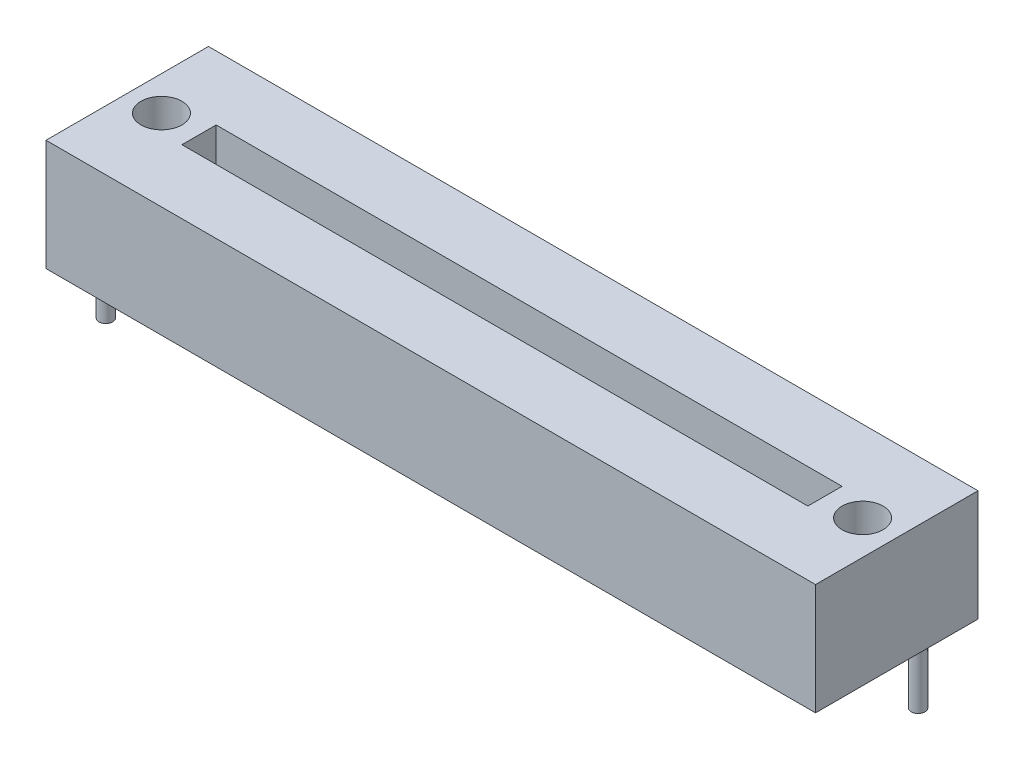
ISO-10303-21;
HEADER;
FILE_DESCRIPTION(('STEP AP214'),'2;1');
FILE_NAME('part.step','',(''),(''),'','','');
FILE_SCHEMA(('AUTOMOTIVE_DESIGN { 1 0 10303 214 1 1 1 1 }'));
ENDSEC;
DATA;
#1=APPLICATION_CONTEXT('core data for automotive mechanical design processes');
#2=APPLICATION_PROTOCOL_DEFINITION('international standard','automotive_design',2000,#1);
#3=PRODUCT_CONTEXT('',#1,'mechanical');
#4=PRODUCT('Part','Part','',(#3));
#5=PRODUCT_RELATED_PRODUCT_CATEGORY('part','',(#4));
#6=PRODUCT_DEFINITION_FORMATION('','',#4);
#7=PRODUCT_DEFINITION_CONTEXT('part definition',#1,'design');
#8=PRODUCT_DEFINITION('design','',#6,#7);
#9=PRODUCT_DEFINITION_SHAPE('','',#8);
#10=(LENGTH_UNIT() NAMED_UNIT(*) SI_UNIT(.MILLI.,.METRE.));
#11=(NAMED_UNIT(*) PLANE_ANGLE_UNIT() SI_UNIT($,.RADIAN.));
#12=(NAMED_UNIT(*) SI_UNIT($,.STERADIAN.) SOLID_ANGLE_UNIT());
#13=UNCERTAINTY_MEASURE_WITH_UNIT(LENGTH_MEASURE(1.E-05),#10,'distance_accuracy_value','');
#14=(GEOMETRIC_REPRESENTATION_CONTEXT(3) GLOBAL_UNCERTAINTY_ASSIGNED_CONTEXT((#13)) GLOBAL_UNIT_ASSIGNED_CONTEXT((#10,
#11,#12)) REPRESENTATION_CONTEXT('',''));
#15=CARTESIAN_POINT('',(0.,0.,0.));
#16=DIRECTION('',(0.,0.,1.));
#17=DIRECTION('',(1.,0.,0.));
#18=AXIS2_PLACEMENT_3D('',#15,#16,#17);
#19=CARTESIAN_POINT('',(0.,6.5,0.));
#20=DIRECTION('',(0.,-1.,0.));
#21=DIRECTION('',(0.,0.,-1.));
#22=AXIS2_PLACEMENT_3D('',#19,#20,#21);
#23=PLANE('',#22);
#24=CARTESIAN_POINT('',(-20.5,6.5,0.));
#25=DIRECTION('',(0.,1.,0.));
#26=DIRECTION('',(0.,0.,1.));
#27=AXIS2_PLACEMENT_3D('',#24,#25,#26);
#28=CIRCLE('',#27,1.2);
#29=CARTESIAN_POINT('',(-20.5,6.5,1.2));
#30=VERTEX_POINT('',#29);
#31=EDGE_CURVE('E413',#30,#30,#28,.T.);
#32=ORIENTED_EDGE('',*,*,#31,.F.);
#33=EDGE_LOOP('',(#32));
#34=FACE_BOUND('',#33,.T.);
#35=CARTESIAN_POINT('',(20.5,6.5,0.));
#36=DIRECTION('',(0.,1.,0.));
#37=DIRECTION('',(0.,0.,1.));
#38=AXIS2_PLACEMENT_3D('',#35,#36,#37);
#39=CIRCLE('',#38,1.2);
#40=CARTESIAN_POINT('',(20.5,6.5,1.19999999999999));
#41=VERTEX_POINT('',#40);
#42=EDGE_CURVE('E139',#41,#41,#39,.T.);
#43=ORIENTED_EDGE('',*,*,#42,.F.);
#44=EDGE_LOOP('',(#43));
#45=FACE_BOUND('',#44,.T.);
#46=DIRECTION('',(0.,0.,-1.));
#47=VECTOR('',#46,1.);
#48=CARTESIAN_POINT('',(22.5,6.5,4.75));
#49=LINE('',#48,#47);
#50=CARTESIAN_POINT('',(22.5,6.5,4.75));
#51=VERTEX_POINT('',#50);
#52=CARTESIAN_POINT('',(22.5,6.5,-4.75));
#53=VERTEX_POINT('',#52);
#54=EDGE_CURVE('E162',#51,#53,#49,.T.);
#55=ORIENTED_EDGE('',*,*,#54,.T.);
#56=DIRECTION('',(-1.,0.,0.));
#57=VECTOR('',#56,1.);
#58=CARTESIAN_POINT('',(-22.5,6.5,-4.75));
#59=LINE('',#58,#57);
#60=CARTESIAN_POINT('',(-22.5,6.5,-4.75));
#61=VERTEX_POINT('',#60);
#62=EDGE_CURVE('E166',#53,#61,#59,.T.);
#63=ORIENTED_EDGE('',*,*,#62,.T.);
#64=DIRECTION('',(0.,0.,1.));
#65=VECTOR('',#64,1.);
#66=CARTESIAN_POINT('',(-22.5,6.5,4.75));
#67=LINE('',#66,#65);
#68=CARTESIAN_POINT('',(-22.5,6.5,4.75));
#69=VERTEX_POINT('',#68);
#70=EDGE_CURVE('E170',#61,#69,#67,.T.);
#71=ORIENTED_EDGE('',*,*,#70,.T.);
#72=DIRECTION('',(1.,0.,0.));
#73=VECTOR('',#72,1.);
#74=CARTESIAN_POINT('',(-22.5,6.5,4.75));
#75=LINE('',#74,#73);
#76=EDGE_CURVE('E173',#69,#51,#75,.T.);
#77=ORIENTED_EDGE('',*,*,#76,.T.);
#78=EDGE_LOOP('',(#55,#63,#71,#77));
#79=FACE_BOUND('',#78,.T.);
#80=DIRECTION('',(0.,0.,-1.));
#81=VECTOR('',#80,1.);
#82=CARTESIAN_POINT('',(18.3,6.5,1.));
#83=LINE('',#82,#81);
#84=CARTESIAN_POINT('',(18.3,6.5,1.));
#85=VERTEX_POINT('',#84);
#86=CARTESIAN_POINT('',(18.3,6.5,-0.999999999999999));
#87=VERTEX_POINT('',#86);
#88=EDGE_CURVE('E129',#85,#87,#83,.T.);
#89=ORIENTED_EDGE('',*,*,#88,.F.);
#90=DIRECTION('',(1.,0.,0.));
#91=VECTOR('',#90,1.);
#92=CARTESIAN_POINT('',(-18.3,6.5,1.));
#93=LINE('',#92,#91);
#94=CARTESIAN_POINT('',(-18.3,6.5,1.));
#95=VERTEX_POINT('',#94);
#96=EDGE_CURVE('E117',#95,#85,#93,.T.);
#97=ORIENTED_EDGE('',*,*,#96,.F.);
#98=DIRECTION('',(0.,0.,1.));
#99=VECTOR('',#98,1.);
#100=CARTESIAN_POINT('',(-18.3,6.5,1.));
#101=LINE('',#100,#99);
#102=CARTESIAN_POINT('',(-18.3,6.5,-0.999999999999999));
#103=VERTEX_POINT('',#102);
#104=EDGE_CURVE('E148',#103,#95,#101,.T.);
#105=ORIENTED_EDGE('',*,*,#104,.F.);
#106=DIRECTION('',(-1.,0.,0.));
#107=VECTOR('',#106,1.);
#108=CARTESIAN_POINT('',(-18.3,6.5,-0.999999999999999));
#109=LINE('',#108,#107);
#110=EDGE_CURVE('E145',#87,#103,#109,.T.);
#111=ORIENTED_EDGE('',*,*,#110,.F.);
#112=EDGE_LOOP('',(#89,#97,#105,#111));
#113=FACE_BOUND('',#112,.T.);
#114=ADVANCED_FACE('F45',(#34,#45,#79,#113),#23,.F.);
#115=CARTESIAN_POINT('',(0.,0.,0.));
#116=DIRECTION('',(0.,-1.,0.));
#117=DIRECTION('',(0.,0.,-1.));
#118=AXIS2_PLACEMENT_3D('',#115,#116,#117);
#119=PLANE('',#118);
#120=CARTESIAN_POINT('',(21.75,0.,-2.));
#121=DIRECTION('',(0.,-1.,0.));
#122=DIRECTION('',(0.,0.,-1.));
#123=AXIS2_PLACEMENT_3D('',#120,#121,#122);
#124=CIRCLE('',#123,0.400000000000001);
#125=CARTESIAN_POINT('',(21.75,0.,-2.4));
#126=VERTEX_POINT('',#125);
#127=EDGE_CURVE('E394',#126,#126,#124,.T.);
#128=ORIENTED_EDGE('',*,*,#127,.F.);
#129=EDGE_LOOP('',(#128));
#130=FACE_BOUND('',#129,.T.);
#131=CARTESIAN_POINT('',(-21.75,0.,-2.));
#132=DIRECTION('',(0.,-1.,0.));
#133=DIRECTION('',(0.,0.,-1.));
#134=AXIS2_PLACEMENT_3D('',#131,#132,#133);
#135=CIRCLE('',#134,0.400000000000001);
#136=CARTESIAN_POINT('',(-21.75,0.,-2.4));
#137=VERTEX_POINT('',#136);
#138=EDGE_CURVE('E401',#137,#137,#135,.T.);
#139=ORIENTED_EDGE('',*,*,#138,.F.);
#140=EDGE_LOOP('',(#139));
#141=FACE_BOUND('',#140,.T.);
#142=CARTESIAN_POINT('',(-21.75,0.,2.));
#143=DIRECTION('',(0.,-1.,0.));
#144=DIRECTION('',(0.,0.,-1.));
#145=AXIS2_PLACEMENT_3D('',#142,#143,#144);
#146=CIRCLE('',#145,0.400000000000001);
#147=CARTESIAN_POINT('',(-21.75,0.,1.6));
#148=VERTEX_POINT('',#147);
#149=EDGE_CURVE('E405',#148,#148,#146,.T.);
#150=ORIENTED_EDGE('',*,*,#149,.F.);
#151=EDGE_LOOP('',(#150));
#152=FACE_BOUND('',#151,.T.);
#153=CARTESIAN_POINT('',(-20.5,0.,0.));
#154=DIRECTION('',(0.,1.,0.));
#155=DIRECTION('',(0.,0.,1.));
#156=AXIS2_PLACEMENT_3D('',#153,#154,#155);
#157=CIRCLE('',#156,1.2);
#158=CARTESIAN_POINT('',(-20.5,0.,1.2));
#159=VERTEX_POINT('',#158);
#160=EDGE_CURVE('E420',#159,#159,#157,.T.);
#161=ORIENTED_EDGE('',*,*,#160,.T.);
#162=EDGE_LOOP('',(#161));
#163=FACE_BOUND('',#162,.T.);
#164=CARTESIAN_POINT('',(20.5,0.,0.));
#165=DIRECTION('',(0.,1.,0.));
#166=DIRECTION('',(0.,0.,1.));
#167=AXIS2_PLACEMENT_3D('',#164,#165,#166);
#168=CIRCLE('',#167,1.2);
#169=CARTESIAN_POINT('',(20.5,0.,1.19999999999999));
#170=VERTEX_POINT('',#169);
#171=EDGE_CURVE('E133',#170,#170,#168,.T.);
#172=ORIENTED_EDGE('',*,*,#171,.T.);
#173=EDGE_LOOP('',(#172));
#174=FACE_BOUND('',#173,.T.);
#175=DIRECTION('',(0.,0.,-1.));
#176=VECTOR('',#175,1.);
#177=CARTESIAN_POINT('',(22.5,0.,4.75));
#178=LINE('',#177,#176);
#179=CARTESIAN_POINT('',(22.5,0.,4.75));
#180=VERTEX_POINT('',#179);
#181=CARTESIAN_POINT('',(22.5,0.,-4.75));
#182=VERTEX_POINT('',#181);
#183=EDGE_CURVE('E161',#180,#182,#178,.T.);
#184=ORIENTED_EDGE('',*,*,#183,.F.);
#185=DIRECTION('',(1.,0.,0.));
#186=VECTOR('',#185,1.);
#187=CARTESIAN_POINT('',(-22.5,0.,4.75));
#188=LINE('',#187,#186);
#189=CARTESIAN_POINT('',(-22.5,0.,4.75));
#190=VERTEX_POINT('',#189);
#191=EDGE_CURVE('E167',#190,#180,#188,.T.);
#192=ORIENTED_EDGE('',*,*,#191,.F.);
#193=DIRECTION('',(0.,0.,1.));
#194=VECTOR('',#193,1.);
#195=CARTESIAN_POINT('',(-22.5,0.,4.75));
#196=LINE('',#195,#194);
#197=CARTESIAN_POINT('',(-22.5,0.,-4.75));
#198=VERTEX_POINT('',#197);
#199=EDGE_CURVE('E184',#198,#190,#196,.T.);
#200=ORIENTED_EDGE('',*,*,#199,.F.);
#201=DIRECTION('',(-1.,0.,0.));
#202=VECTOR('',#201,1.);
#203=CARTESIAN_POINT('',(-22.5,0.,-4.75));
#204=LINE('',#203,#202);
#205=EDGE_CURVE('E180',#182,#198,#204,.T.);
#206=ORIENTED_EDGE('',*,*,#205,.F.);
#207=EDGE_LOOP('',(#184,#192,#200,#206));
#208=FACE_BOUND('',#207,.T.);
#209=ADVANCED_FACE('F209',(#130,#141,#152,#163,#174,#208),#119,.T.);
#210=CARTESIAN_POINT('',(22.5,6.5,4.75));
#211=DIRECTION('',(-1.,0.,0.));
#212=DIRECTION('',(0.,0.,1.));
#213=AXIS2_PLACEMENT_3D('',#210,#211,#212);
#214=PLANE('',#213);
#215=DIRECTION('',(0.,-1.,0.));
#216=VECTOR('',#215,1.);
#217=CARTESIAN_POINT('',(22.5,6.5,4.75));
#218=LINE('',#217,#216);
#219=EDGE_CURVE('E176',#51,#180,#218,.T.);
#220=ORIENTED_EDGE('',*,*,#219,.T.);
#221=ORIENTED_EDGE('',*,*,#183,.T.);
#222=DIRECTION('',(0.,-1.,0.));
#223=VECTOR('',#222,1.);
#224=CARTESIAN_POINT('',(22.5,6.5,-4.75));
#225=LINE('',#224,#223);
#226=EDGE_CURVE('E54',#53,#182,#225,.T.);
#227=ORIENTED_EDGE('',*,*,#226,.F.);
#228=ORIENTED_EDGE('',*,*,#54,.F.);
#229=EDGE_LOOP('',(#220,#221,#227,#228));
#230=FACE_BOUND('',#229,.T.);
#231=ADVANCED_FACE('F47',(#230),#214,.F.);
#232=CARTESIAN_POINT('',(-22.5,6.5,-4.75));
#233=DIRECTION('',(0.,0.,1.));
#234=DIRECTION('',(1.,0.,0.));
#235=AXIS2_PLACEMENT_3D('',#232,#233,#234);
#236=PLANE('',#235);
#237=ORIENTED_EDGE('',*,*,#226,.T.);
#238=ORIENTED_EDGE('',*,*,#205,.T.);
#239=DIRECTION('',(0.,-1.,0.));
#240=VECTOR('',#239,1.);
#241=CARTESIAN_POINT('',(-22.5,6.5,-4.75));
#242=LINE('',#241,#240);
#243=EDGE_CURVE('E196',#61,#198,#242,.T.);
#244=ORIENTED_EDGE('',*,*,#243,.F.);
#245=ORIENTED_EDGE('',*,*,#62,.F.);
#246=EDGE_LOOP('',(#237,#238,#244,#245));
#247=FACE_BOUND('',#246,.T.);
#248=ADVANCED_FACE('F202',(#247),#236,.F.);
#249=CARTESIAN_POINT('',(-22.5,6.5,4.75));
#250=DIRECTION('',(1.,0.,0.));
#251=DIRECTION('',(0.,0.,-1.));
#252=AXIS2_PLACEMENT_3D('',#249,#250,#251);
#253=PLANE('',#252);
#254=ORIENTED_EDGE('',*,*,#243,.T.);
#255=ORIENTED_EDGE('',*,*,#199,.T.);
#256=DIRECTION('',(0.,-1.,0.));
#257=VECTOR('',#256,1.);
#258=CARTESIAN_POINT('',(-22.5,6.5,4.75));
#259=LINE('',#258,#257);
#260=EDGE_CURVE('E193',#69,#190,#259,.T.);
#261=ORIENTED_EDGE('',*,*,#260,.F.);
#262=ORIENTED_EDGE('',*,*,#70,.F.);
#263=EDGE_LOOP('',(#254,#255,#261,#262));
#264=FACE_BOUND('',#263,.T.);
#265=ADVANCED_FACE('F218',(#264),#253,.F.);
#266=CARTESIAN_POINT('',(-22.5,6.5,4.75));
#267=DIRECTION('',(0.,0.,-1.));
#268=DIRECTION('',(-1.,0.,0.));
#269=AXIS2_PLACEMENT_3D('',#266,#267,#268);
#270=PLANE('',#269);
#271=ORIENTED_EDGE('',*,*,#260,.T.);
#272=ORIENTED_EDGE('',*,*,#191,.T.);
#273=ORIENTED_EDGE('',*,*,#219,.F.);
#274=ORIENTED_EDGE('',*,*,#76,.F.);
#275=EDGE_LOOP('',(#271,#272,#273,#274));
#276=FACE_BOUND('',#275,.T.);
#277=ADVANCED_FACE('F214',(#276),#270,.F.);
#278=CARTESIAN_POINT('',(18.3,6.5,1.));
#279=DIRECTION('',(-1.,0.,0.));
#280=DIRECTION('',(0.,0.,1.));
#281=AXIS2_PLACEMENT_3D('',#278,#279,#280);
#282=PLANE('',#281);
#283=DIRECTION('',(0.,0.,-1.));
#284=VECTOR('',#283,1.);
#285=CARTESIAN_POINT('',(18.3,2.,1.));
#286=LINE('',#285,#284);
#287=CARTESIAN_POINT('',(18.3,2.,1.));
#288=VERTEX_POINT('',#287);
#289=CARTESIAN_POINT('',(18.3,2.,-0.999999999999999));
#290=VERTEX_POINT('',#289);
#291=EDGE_CURVE('E124',#288,#290,#286,.T.);
#292=ORIENTED_EDGE('',*,*,#291,.F.);
#293=DIRECTION('',(0.,-1.,0.));
#294=VECTOR('',#293,1.);
#295=CARTESIAN_POINT('',(18.3,6.5,1.));
#296=LINE('',#295,#294);
#297=EDGE_CURVE('E113',#85,#288,#296,.T.);
#298=ORIENTED_EDGE('',*,*,#297,.F.);
#299=ORIENTED_EDGE('',*,*,#88,.T.);
#300=DIRECTION('',(0.,-1.,0.));
#301=VECTOR('',#300,1.);
#302=CARTESIAN_POINT('',(18.3,6.5,-0.999999999999999));
#303=LINE('',#302,#301);
#304=EDGE_CURVE('E126',#87,#290,#303,.T.);
#305=ORIENTED_EDGE('',*,*,#304,.T.);
#306=EDGE_LOOP('',(#292,#298,#299,#305));
#307=FACE_BOUND('',#306,.T.);
#308=ADVANCED_FACE('F125',(#307),#282,.T.);
#309=CARTESIAN_POINT('',(-18.3,6.5,-0.999999999999999));
#310=DIRECTION('',(0.,0.,1.));
#311=DIRECTION('',(1.,0.,0.));
#312=AXIS2_PLACEMENT_3D('',#309,#310,#311);
#313=PLANE('',#312);
#314=DIRECTION('',(-1.,0.,0.));
#315=VECTOR('',#314,1.);
#316=CARTESIAN_POINT('',(-18.3,2.,-0.999999999999999));
#317=LINE('',#316,#315);
#318=CARTESIAN_POINT('',(-18.3,2.,-0.999999999999999));
#319=VERTEX_POINT('',#318);
#320=EDGE_CURVE('E61',#290,#319,#317,.T.);
#321=ORIENTED_EDGE('',*,*,#320,.F.);
#322=ORIENTED_EDGE('',*,*,#304,.F.);
#323=ORIENTED_EDGE('',*,*,#110,.T.);
#324=DIRECTION('',(0.,-1.,0.));
#325=VECTOR('',#324,1.);
#326=CARTESIAN_POINT('',(-18.3,6.5,-0.999999999999999));
#327=LINE('',#326,#325);
#328=EDGE_CURVE('E156',#103,#319,#327,.T.);
#329=ORIENTED_EDGE('',*,*,#328,.T.);
#330=EDGE_LOOP('',(#321,#322,#323,#329));
#331=FACE_BOUND('',#330,.T.);
#332=ADVANCED_FACE('F226',(#331),#313,.T.);
#333=CARTESIAN_POINT('',(-18.3,6.5,1.));
#334=DIRECTION('',(1.,0.,0.));
#335=DIRECTION('',(0.,0.,-1.));
#336=AXIS2_PLACEMENT_3D('',#333,#334,#335);
#337=PLANE('',#336);
#338=DIRECTION('',(0.,0.,1.));
#339=VECTOR('',#338,1.);
#340=CARTESIAN_POINT('',(-18.3,2.,1.));
#341=LINE('',#340,#339);
#342=CARTESIAN_POINT('',(-18.3,2.,1.));
#343=VERTEX_POINT('',#342);
#344=EDGE_CURVE('E69',#319,#343,#341,.T.);
#345=ORIENTED_EDGE('',*,*,#344,.F.);
#346=ORIENTED_EDGE('',*,*,#328,.F.);
#347=ORIENTED_EDGE('',*,*,#104,.T.);
#348=DIRECTION('',(0.,-1.,0.));
#349=VECTOR('',#348,1.);
#350=CARTESIAN_POINT('',(-18.3,6.5,1.));
#351=LINE('',#350,#349);
#352=EDGE_CURVE('E121',#95,#343,#351,.T.);
#353=ORIENTED_EDGE('',*,*,#352,.T.);
#354=EDGE_LOOP('',(#345,#346,#347,#353));
#355=FACE_BOUND('',#354,.T.);
#356=ADVANCED_FACE('F227',(#355),#337,.T.);
#357=CARTESIAN_POINT('',(-18.3,6.5,1.));
#358=DIRECTION('',(0.,0.,-1.));
#359=DIRECTION('',(-1.,0.,0.));
#360=AXIS2_PLACEMENT_3D('',#357,#358,#359);
#361=PLANE('',#360);
#362=DIRECTION('',(1.,0.,0.));
#363=VECTOR('',#362,1.);
#364=CARTESIAN_POINT('',(-18.3,2.,1.));
#365=LINE('',#364,#363);
#366=EDGE_CURVE('E11',#343,#288,#365,.T.);
#367=ORIENTED_EDGE('',*,*,#366,.F.);
#368=ORIENTED_EDGE('',*,*,#352,.F.);
#369=ORIENTED_EDGE('',*,*,#96,.T.);
#370=ORIENTED_EDGE('',*,*,#297,.T.);
#371=EDGE_LOOP('',(#367,#368,#369,#370));
#372=FACE_BOUND('',#371,.T.);
#373=ADVANCED_FACE('F115',(#372),#361,.T.);
#374=CARTESIAN_POINT('',(0.,2.,0.));
#375=DIRECTION('',(0.,1.,0.));
#376=DIRECTION('',(0.,0.,1.));
#377=AXIS2_PLACEMENT_3D('',#374,#375,#376);
#378=PLANE('',#377);
#379=ORIENTED_EDGE('',*,*,#366,.T.);
#380=ORIENTED_EDGE('',*,*,#291,.T.);
#381=ORIENTED_EDGE('',*,*,#320,.T.);
#382=ORIENTED_EDGE('',*,*,#344,.T.);
#383=EDGE_LOOP('',(#379,#380,#381,#382));
#384=FACE_BOUND('',#383,.T.);
#385=ADVANCED_FACE('F131',(#384),#378,.T.);
#386=CARTESIAN_POINT('',(20.5,6.5,0.));
#387=DIRECTION('',(0.,1.,0.));
#388=DIRECTION('',(0.,0.,1.));
#389=AXIS2_PLACEMENT_3D('',#386,#387,#388);
#390=CYLINDRICAL_SURFACE('',#389,1.2);
#391=ORIENTED_EDGE('',*,*,#171,.F.);
#392=EDGE_LOOP('',(#391));
#393=FACE_BOUND('',#392,.T.);
#394=ORIENTED_EDGE('',*,*,#42,.T.);
#395=EDGE_LOOP('',(#394));
#396=FACE_BOUND('',#395,.T.);
#397=ADVANCED_FACE('F311',(#393,#396),#390,.F.);
#398=CARTESIAN_POINT('',(-20.5,6.5,0.));
#399=DIRECTION('',(0.,1.,0.));
#400=DIRECTION('',(0.,0.,1.));
#401=AXIS2_PLACEMENT_3D('',#398,#399,#400);
#402=CYLINDRICAL_SURFACE('',#401,1.2);
#403=ORIENTED_EDGE('',*,*,#160,.F.);
#404=EDGE_LOOP('',(#403));
#405=FACE_BOUND('',#404,.T.);
#406=ORIENTED_EDGE('',*,*,#31,.T.);
#407=EDGE_LOOP('',(#406));
#408=FACE_BOUND('',#407,.T.);
#409=ADVANCED_FACE('F319',(#405,#408),#402,.F.);
#410=CARTESIAN_POINT('',(-21.75,-3.5,2.));
#411=DIRECTION('',(0.,1.,0.));
#412=DIRECTION('',(0.,0.,1.));
#413=AXIS2_PLACEMENT_3D('',#410,#411,#412);
#414=CYLINDRICAL_SURFACE('',#413,0.400000000000001);
#415=CARTESIAN_POINT('',(-21.75,-3.5,2.));
#416=DIRECTION('',(0.,-1.,0.));
#417=DIRECTION('',(0.,0.,-1.));
#418=AXIS2_PLACEMENT_3D('',#415,#416,#417);
#419=CIRCLE('',#418,0.400000000000001);
#420=CARTESIAN_POINT('',(-21.75,-3.5,1.6));
#421=VERTEX_POINT('',#420);
#422=EDGE_CURVE('E409',#421,#421,#419,.T.);
#423=ORIENTED_EDGE('',*,*,#422,.F.);
#424=EDGE_LOOP('',(#423));
#425=FACE_BOUND('',#424,.T.);
#426=ORIENTED_EDGE('',*,*,#149,.T.);
#427=EDGE_LOOP('',(#426));
#428=FACE_BOUND('',#427,.T.);
#429=ADVANCED_FACE('F328',(#425,#428),#414,.T.);
#430=CARTESIAN_POINT('',(-21.75,-3.5,2.));
#431=DIRECTION('',(0.,-1.,0.));
#432=DIRECTION('',(0.,0.,-1.));
#433=AXIS2_PLACEMENT_3D('',#430,#431,#432);
#434=PLANE('',#433);
#435=ORIENTED_EDGE('',*,*,#422,.T.);
#436=EDGE_LOOP('',(#435));
#437=FACE_BOUND('',#436,.T.);
#438=ADVANCED_FACE('F337',(#437),#434,.T.);
#439=CARTESIAN_POINT('',(-21.75,-3.5,-2.));
#440=DIRECTION('',(0.,1.,0.));
#441=DIRECTION('',(0.,0.,1.));
#442=AXIS2_PLACEMENT_3D('',#439,#440,#441);
#443=CYLINDRICAL_SURFACE('',#442,0.400000000000001);
#444=CARTESIAN_POINT('',(-21.75,-3.5,-2.));
#445=DIRECTION('',(0.,-1.,0.));
#446=DIRECTION('',(0.,0.,-1.));
#447=AXIS2_PLACEMENT_3D('',#444,#445,#446);
#448=CIRCLE('',#447,0.400000000000001);
#449=CARTESIAN_POINT('',(-21.75,-3.5,-2.4));
#450=VERTEX_POINT('',#449);
#451=EDGE_CURVE('E398',#450,#450,#448,.T.);
#452=ORIENTED_EDGE('',*,*,#451,.F.);
#453=EDGE_LOOP('',(#452));
#454=FACE_BOUND('',#453,.T.);
#455=ORIENTED_EDGE('',*,*,#138,.T.);
#456=EDGE_LOOP('',(#455));
#457=FACE_BOUND('',#456,.T.);
#458=ADVANCED_FACE('F347',(#454,#457),#443,.T.);
#459=CARTESIAN_POINT('',(-21.75,-3.5,-2.));
#460=DIRECTION('',(0.,-1.,0.));
#461=DIRECTION('',(0.,0.,-1.));
#462=AXIS2_PLACEMENT_3D('',#459,#460,#461);
#463=PLANE('',#462);
#464=ORIENTED_EDGE('',*,*,#451,.T.);
#465=EDGE_LOOP('',(#464));
#466=FACE_BOUND('',#465,.T.);
#467=ADVANCED_FACE('F357',(#466),#463,.T.);
#468=CARTESIAN_POINT('',(21.75,-3.5,-2.));
#469=DIRECTION('',(0.,1.,0.));
#470=DIRECTION('',(0.,0.,1.));
#471=AXIS2_PLACEMENT_3D('',#468,#469,#470);
#472=CYLINDRICAL_SURFACE('',#471,0.400000000000001);
#473=CARTESIAN_POINT('',(21.75,-3.5,-2.));
#474=DIRECTION('',(0.,-1.,0.));
#475=DIRECTION('',(0.,0.,-1.));
#476=AXIS2_PLACEMENT_3D('',#473,#474,#475);
#477=CIRCLE('',#476,0.400000000000001);
#478=CARTESIAN_POINT('',(21.75,-3.5,-2.4));
#479=VERTEX_POINT('',#478);
#480=EDGE_CURVE('E392',#479,#479,#477,.T.);
#481=ORIENTED_EDGE('',*,*,#480,.F.);
#482=EDGE_LOOP('',(#481));
#483=FACE_BOUND('',#482,.T.);
#484=ORIENTED_EDGE('',*,*,#127,.T.);
#485=EDGE_LOOP('',(#484));
#486=FACE_BOUND('',#485,.T.);
#487=ADVANCED_FACE('F367',(#483,#486),#472,.T.);
#488=CARTESIAN_POINT('',(21.75,-3.5,-2.));
#489=DIRECTION('',(0.,-1.,0.));
#490=DIRECTION('',(0.,0.,-1.));
#491=AXIS2_PLACEMENT_3D('',#488,#489,#490);
#492=PLANE('',#491);
#493=ORIENTED_EDGE('',*,*,#480,.T.);
#494=EDGE_LOOP('',(#493));
#495=FACE_BOUND('',#494,.T.);
#496=ADVANCED_FACE('F377',(#495),#492,.T.);
#497=CLOSED_SHELL('',(#114,#209,#231,#248,#265,#277,#308,#332,#356,#373,#385,#397,#409,#429,
#438,#458,#467,#487,#496));
#498=MANIFOLD_SOLID_BREP('B2',#497);
#499=ADVANCED_BREP_SHAPE_REPRESENTATION('',(#18,#498),#14);
#500=SHAPE_DEFINITION_REPRESENTATION(#9,#499);
ENDSEC;
END-ISO-10303-21;
